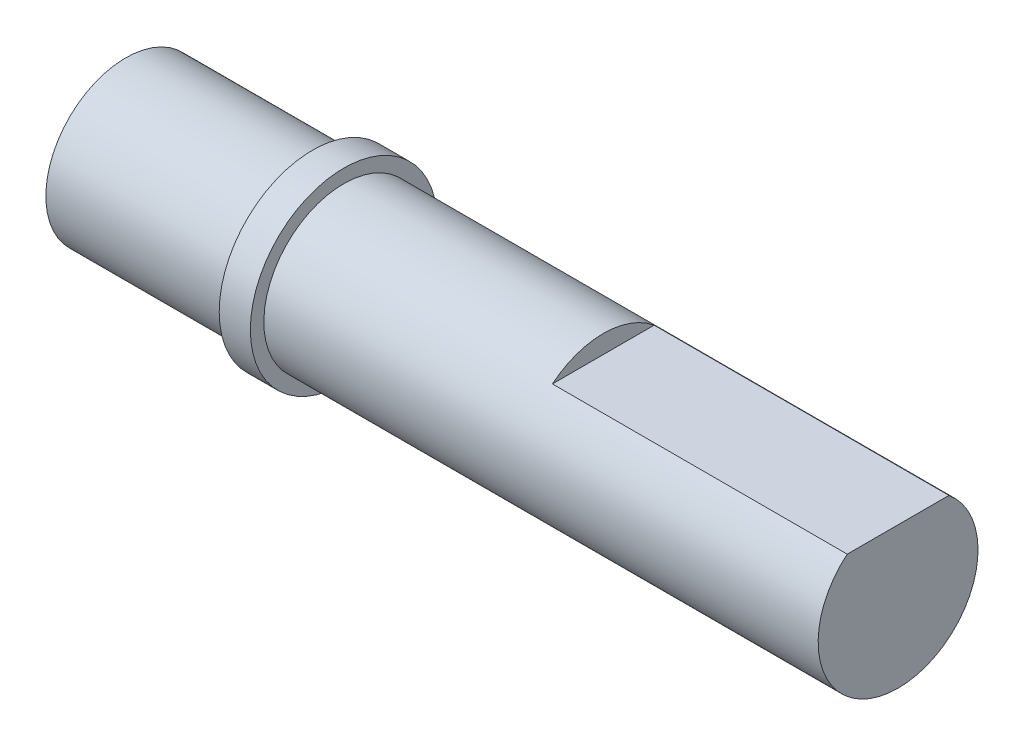
ISO-10303-21;
HEADER;
FILE_DESCRIPTION(('STEP AP214'),'2;1');
FILE_NAME('part.step','',(''),(''),'','','');
FILE_SCHEMA(('AUTOMOTIVE_DESIGN { 1 0 10303 214 1 1 1 1 }'));
ENDSEC;
DATA;
#1=APPLICATION_CONTEXT('core data for automotive mechanical design processes');
#2=APPLICATION_PROTOCOL_DEFINITION('international standard','automotive_design',2000,#1);
#3=PRODUCT_CONTEXT('',#1,'mechanical');
#4=PRODUCT('Part','Part','',(#3));
#5=PRODUCT_RELATED_PRODUCT_CATEGORY('part','',(#4));
#6=PRODUCT_DEFINITION_FORMATION('','',#4);
#7=PRODUCT_DEFINITION_CONTEXT('part definition',#1,'design');
#8=PRODUCT_DEFINITION('design','',#6,#7);
#9=PRODUCT_DEFINITION_SHAPE('','',#8);
#10=(LENGTH_UNIT() NAMED_UNIT(*) SI_UNIT(.MILLI.,.METRE.));
#11=(NAMED_UNIT(*) PLANE_ANGLE_UNIT() SI_UNIT($,.RADIAN.));
#12=(NAMED_UNIT(*) SI_UNIT($,.STERADIAN.) SOLID_ANGLE_UNIT());
#13=UNCERTAINTY_MEASURE_WITH_UNIT(LENGTH_MEASURE(1.E-05),#10,'distance_accuracy_value','');
#14=(GEOMETRIC_REPRESENTATION_CONTEXT(3) GLOBAL_UNCERTAINTY_ASSIGNED_CONTEXT((#13)) GLOBAL_UNIT_ASSIGNED_CONTEXT((#10,
#11,#12)) REPRESENTATION_CONTEXT('',''));
#15=CARTESIAN_POINT('',(0.,0.,0.));
#16=DIRECTION('',(0.,0.,1.));
#17=DIRECTION('',(1.,0.,0.));
#18=AXIS2_PLACEMENT_3D('',#15,#16,#17);
#19=CARTESIAN_POINT('',(28.2,2.9698484809835,0.));
#20=DIRECTION('',(0.,1.,0.));
#21=DIRECTION('',(0.,0.,1.));
#22=AXIS2_PLACEMENT_3D('',#19,#20,#21);
#23=PLANE('',#22);
#24=DIRECTION('',(0.,0.,-1.));
#25=VECTOR('',#24,1.);
#26=CARTESIAN_POINT('',(14.,2.9698484809835,0.));
#27=LINE('',#26,#25);
#28=CARTESIAN_POINT('',(14.,2.9698484809835,2.45));
#29=VERTEX_POINT('',#28);
#30=CARTESIAN_POINT('',(14.,2.9698484809835,-2.45));
#31=VERTEX_POINT('',#30);
#32=EDGE_CURVE('E58',#29,#31,#27,.T.);
#33=ORIENTED_EDGE('',*,*,#32,.F.);
#34=DIRECTION('',(-1.,0.,0.));
#35=VECTOR('',#34,1.);
#36=CARTESIAN_POINT('',(28.2,2.9698484809835,2.45));
#37=LINE('',#36,#35);
#38=CARTESIAN_POINT('',(28.2,2.9698484809835,2.45));
#39=VERTEX_POINT('',#38);
#40=EDGE_CURVE('E11',#39,#29,#37,.T.);
#41=ORIENTED_EDGE('',*,*,#40,.F.);
#42=DIRECTION('',(0.,0.,-1.));
#43=VECTOR('',#42,1.);
#44=CARTESIAN_POINT('',(28.2,2.9698484809835,0.));
#45=LINE('',#44,#43);
#46=CARTESIAN_POINT('',(28.2,2.9698484809835,-2.45));
#47=VERTEX_POINT('',#46);
#48=EDGE_CURVE('E65',#39,#47,#45,.T.);
#49=ORIENTED_EDGE('',*,*,#48,.T.);
#50=DIRECTION('',(-1.,0.,0.));
#51=VECTOR('',#50,1.);
#52=CARTESIAN_POINT('',(28.2,2.9698484809835,-2.45));
#53=LINE('',#52,#51);
#54=EDGE_CURVE('E47',#47,#31,#53,.T.);
#55=ORIENTED_EDGE('',*,*,#54,.T.);
#56=EDGE_LOOP('',(#33,#41,#49,#55));
#57=FACE_BOUND('',#56,.T.);
#58=ADVANCED_FACE('F39',(#57),#23,.T.);
#59=CARTESIAN_POINT('',(28.2,0.,0.));
#60=DIRECTION('',(-1.,0.,0.));
#61=DIRECTION('',(0.,0.,1.));
#62=AXIS2_PLACEMENT_3D('',#59,#60,#61);
#63=CYLINDRICAL_SURFACE('',#62,3.85);
#64=CARTESIAN_POINT('',(1.5,0.,0.));
#65=DIRECTION('',(1.,0.,0.));
#66=DIRECTION('',(0.,0.,-1.));
#67=AXIS2_PLACEMENT_3D('',#64,#65,#66);
#68=CIRCLE('',#67,3.85);
#69=CARTESIAN_POINT('',(1.5,0.,-3.85));
#70=VERTEX_POINT('',#69);
#71=EDGE_CURVE('E79',#70,#70,#68,.T.);
#72=ORIENTED_EDGE('',*,*,#71,.T.);
#73=EDGE_LOOP('',(#72));
#74=FACE_BOUND('',#73,.T.);
#75=ORIENTED_EDGE('',*,*,#40,.T.);
#76=CARTESIAN_POINT('',(14.,0.,0.));
#77=DIRECTION('',(1.,0.,0.));
#78=DIRECTION('',(0.,0.,-1.));
#79=AXIS2_PLACEMENT_3D('',#76,#77,#78);
#80=CIRCLE('',#79,3.85);
#81=EDGE_CURVE('E86',#31,#29,#80,.T.);
#82=ORIENTED_EDGE('',*,*,#81,.F.);
#83=ORIENTED_EDGE('',*,*,#54,.F.);
#84=CARTESIAN_POINT('',(28.2,0.,0.));
#85=DIRECTION('',(1.,0.,0.));
#86=DIRECTION('',(0.,0.,-1.));
#87=AXIS2_PLACEMENT_3D('',#84,#85,#86);
#88=CIRCLE('',#87,3.85);
#89=EDGE_CURVE('E68',#39,#47,#88,.T.);
#90=ORIENTED_EDGE('',*,*,#89,.F.);
#91=EDGE_LOOP('',(#75,#82,#83,#90));
#92=FACE_BOUND('',#91,.T.);
#93=ADVANCED_FACE('F69',(#74,#92),#63,.T.);
#94=CARTESIAN_POINT('',(28.2,0.,0.));
#95=DIRECTION('',(1.,0.,0.));
#96=DIRECTION('',(0.,0.,-1.));
#97=AXIS2_PLACEMENT_3D('',#94,#95,#96);
#98=PLANE('',#97);
#99=ORIENTED_EDGE('',*,*,#48,.F.);
#100=ORIENTED_EDGE('',*,*,#89,.T.);
#101=EDGE_LOOP('',(#99,#100));
#102=FACE_BOUND('',#101,.T.);
#103=ADVANCED_FACE('F73',(#102),#98,.T.);
#104=CARTESIAN_POINT('',(0.,0.,0.));
#105=DIRECTION('',(1.,0.,0.));
#106=DIRECTION('',(0.,0.,-1.));
#107=AXIS2_PLACEMENT_3D('',#104,#105,#106);
#108=PLANE('',#107);
#109=CARTESIAN_POINT('',(0.,0.,0.));
#110=DIRECTION('',(1.,0.,0.));
#111=DIRECTION('',(0.,0.,-1.));
#112=AXIS2_PLACEMENT_3D('',#109,#110,#111);
#113=CIRCLE('',#112,3.85);
#114=CARTESIAN_POINT('',(0.,0.,-3.85));
#115=VERTEX_POINT('',#114);
#116=EDGE_CURVE('E96',#115,#115,#113,.T.);
#117=ORIENTED_EDGE('',*,*,#116,.T.);
#118=EDGE_LOOP('',(#117));
#119=FACE_BOUND('',#118,.T.);
#120=CARTESIAN_POINT('',(0.,0.,0.));
#121=DIRECTION('',(1.,0.,0.));
#122=DIRECTION('',(0.,0.,-1.));
#123=AXIS2_PLACEMENT_3D('',#120,#121,#122);
#124=CIRCLE('',#123,4.5);
#125=CARTESIAN_POINT('',(0.,0.,-4.5));
#126=VERTEX_POINT('',#125);
#127=EDGE_CURVE('E82',#126,#126,#124,.T.);
#128=ORIENTED_EDGE('',*,*,#127,.F.);
#129=EDGE_LOOP('',(#128));
#130=FACE_BOUND('',#129,.T.);
#131=ADVANCED_FACE('F123',(#119,#130),#108,.F.);
#132=CARTESIAN_POINT('',(1.5,0.,0.));
#133=DIRECTION('',(-1.,0.,0.));
#134=DIRECTION('',(0.,0.,1.));
#135=AXIS2_PLACEMENT_3D('',#132,#133,#134);
#136=CYLINDRICAL_SURFACE('',#135,4.5);
#137=CARTESIAN_POINT('',(1.5,0.,0.));
#138=DIRECTION('',(1.,0.,0.));
#139=DIRECTION('',(0.,0.,-1.));
#140=AXIS2_PLACEMENT_3D('',#137,#138,#139);
#141=CIRCLE('',#140,4.5);
#142=CARTESIAN_POINT('',(1.5,0.,-4.5));
#143=VERTEX_POINT('',#142);
#144=EDGE_CURVE('E75',#143,#143,#141,.T.);
#145=ORIENTED_EDGE('',*,*,#144,.F.);
#146=EDGE_LOOP('',(#145));
#147=FACE_BOUND('',#146,.T.);
#148=ORIENTED_EDGE('',*,*,#127,.T.);
#149=EDGE_LOOP('',(#148));
#150=FACE_BOUND('',#149,.T.);
#151=ADVANCED_FACE('F127',(#147,#150),#136,.T.);
#152=CARTESIAN_POINT('',(1.5,0.,0.));
#153=DIRECTION('',(1.,0.,0.));
#154=DIRECTION('',(0.,0.,-1.));
#155=AXIS2_PLACEMENT_3D('',#152,#153,#154);
#156=PLANE('',#155);
#157=ORIENTED_EDGE('',*,*,#71,.F.);
#158=EDGE_LOOP('',(#157));
#159=FACE_BOUND('',#158,.T.);
#160=ORIENTED_EDGE('',*,*,#144,.T.);
#161=EDGE_LOOP('',(#160));
#162=FACE_BOUND('',#161,.T.);
#163=ADVANCED_FACE('F132',(#159,#162),#156,.T.);
#164=CARTESIAN_POINT('',(14.,0.,0.));
#165=DIRECTION('',(1.,0.,0.));
#166=DIRECTION('',(0.,0.,-1.));
#167=AXIS2_PLACEMENT_3D('',#164,#165,#166);
#168=PLANE('',#167);
#169=ORIENTED_EDGE('',*,*,#32,.T.);
#170=ORIENTED_EDGE('',*,*,#81,.T.);
#171=EDGE_LOOP('',(#169,#170));
#172=FACE_BOUND('',#171,.T.);
#173=ADVANCED_FACE('F113',(#172),#168,.T.);
#174=CARTESIAN_POINT('',(-9.,0.,0.));
#175=DIRECTION('',(1.,0.,0.));
#176=DIRECTION('',(0.,0.,-1.));
#177=AXIS2_PLACEMENT_3D('',#174,#175,#176);
#178=CYLINDRICAL_SURFACE('',#177,3.85);
#179=CARTESIAN_POINT('',(-9.,0.,0.));
#180=DIRECTION('',(1.,0.,0.));
#181=DIRECTION('',(0.,0.,-1.));
#182=AXIS2_PLACEMENT_3D('',#179,#180,#181);
#183=CIRCLE('',#182,3.85);
#184=CARTESIAN_POINT('',(-9.,0.,-3.85));
#185=VERTEX_POINT('',#184);
#186=EDGE_CURVE('E95',#185,#185,#183,.T.);
#187=ORIENTED_EDGE('',*,*,#186,.T.);
#188=EDGE_LOOP('',(#187));
#189=FACE_BOUND('',#188,.T.);
#190=ORIENTED_EDGE('',*,*,#116,.F.);
#191=EDGE_LOOP('',(#190));
#192=FACE_BOUND('',#191,.T.);
#193=ADVANCED_FACE('F104',(#189,#192),#178,.T.);
#194=CARTESIAN_POINT('',(-9.,0.,0.));
#195=DIRECTION('',(1.,0.,0.));
#196=DIRECTION('',(0.,0.,-1.));
#197=AXIS2_PLACEMENT_3D('',#194,#195,#196);
#198=PLANE('',#197);
#199=ORIENTED_EDGE('',*,*,#186,.F.);
#200=EDGE_LOOP('',(#199));
#201=FACE_BOUND('',#200,.T.);
#202=ADVANCED_FACE('F107',(#201),#198,.F.);
#203=CLOSED_SHELL('',(#58,#93,#103,#131,#151,#163,#173,#193,#202));
#204=MANIFOLD_SOLID_BREP('B2',#203);
#205=ADVANCED_BREP_SHAPE_REPRESENTATION('',(#18,#204),#14);
#206=SHAPE_DEFINITION_REPRESENTATION(#9,#205);
ENDSEC;
END-ISO-10303-21;
